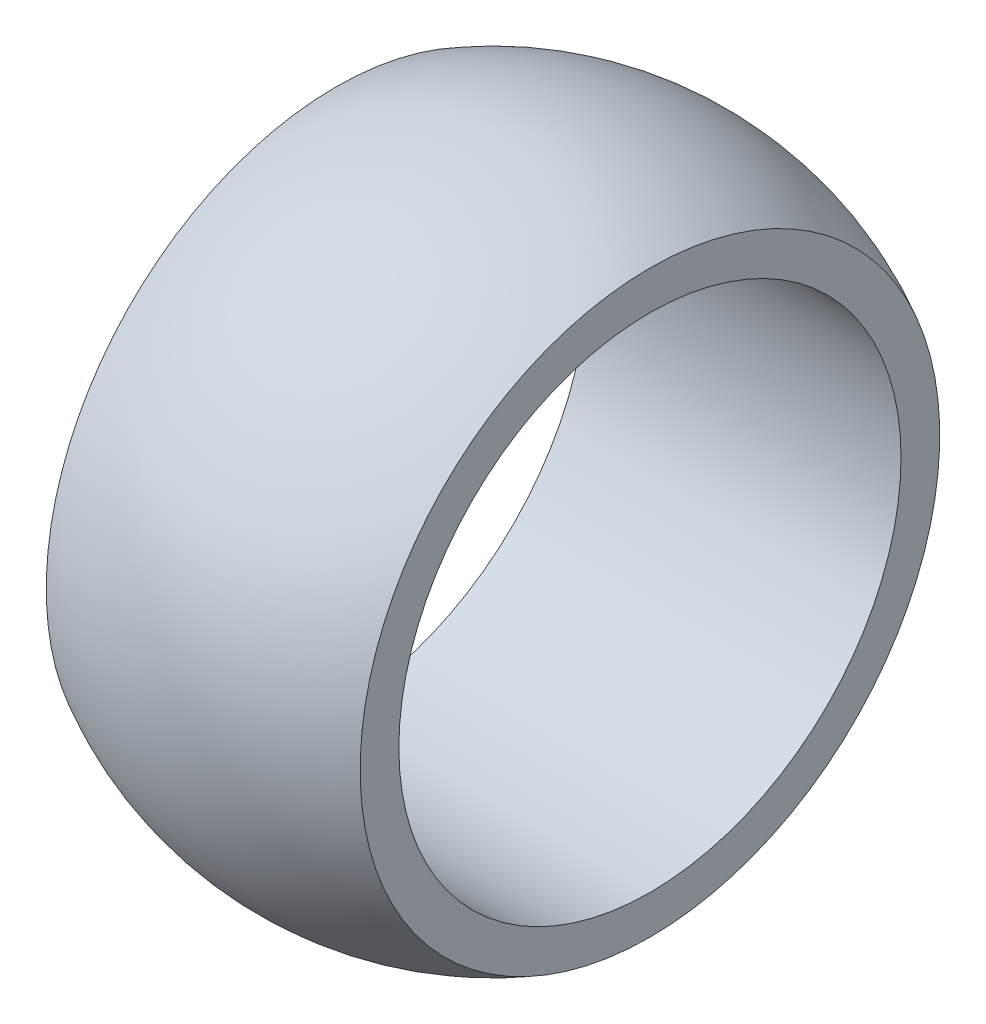
ISO-10303-21;
HEADER;
FILE_DESCRIPTION(('STEP AP214'),'2;1');
FILE_NAME('part.step','',(''),(''),'','','');
FILE_SCHEMA(('AUTOMOTIVE_DESIGN { 1 0 10303 214 1 1 1 1 }'));
ENDSEC;
DATA;
#1=APPLICATION_CONTEXT('core data for automotive mechanical design processes');
#2=APPLICATION_PROTOCOL_DEFINITION('international standard','automotive_design',2000,#1);
#3=PRODUCT_CONTEXT('',#1,'mechanical');
#4=PRODUCT('Part','Part','',(#3));
#5=PRODUCT_RELATED_PRODUCT_CATEGORY('part','',(#4));
#6=PRODUCT_DEFINITION_FORMATION('','',#4);
#7=PRODUCT_DEFINITION_CONTEXT('part definition',#1,'design');
#8=PRODUCT_DEFINITION('design','',#6,#7);
#9=PRODUCT_DEFINITION_SHAPE('','',#8);
#10=(LENGTH_UNIT() NAMED_UNIT(*) SI_UNIT(.MILLI.,.METRE.));
#11=(NAMED_UNIT(*) PLANE_ANGLE_UNIT() SI_UNIT($,.RADIAN.));
#12=(NAMED_UNIT(*) SI_UNIT($,.STERADIAN.) SOLID_ANGLE_UNIT());
#13=UNCERTAINTY_MEASURE_WITH_UNIT(LENGTH_MEASURE(1.E-05),#10,'distance_accuracy_value','');
#14=(GEOMETRIC_REPRESENTATION_CONTEXT(3) GLOBAL_UNCERTAINTY_ASSIGNED_CONTEXT((#13)) GLOBAL_UNIT_ASSIGNED_CONTEXT((#10,
#11,#12)) REPRESENTATION_CONTEXT('',''));
#15=CARTESIAN_POINT('',(0.,0.,0.));
#16=DIRECTION('',(0.,0.,1.));
#17=DIRECTION('',(1.,0.,0.));
#18=AXIS2_PLACEMENT_3D('',#15,#16,#17);
#19=CARTESIAN_POINT('',(0.,0.,0.));
#20=DIRECTION('',(-1.,0.,0.));
#21=DIRECTION('',(0.,1.,0.));
#22=AXIS2_PLACEMENT_3D('',#19,#20,#21);
#23=SPHERICAL_SURFACE('',#22,5.25);
#24=CARTESIAN_POINT('',(-2.5,0.,0.));
#25=DIRECTION('',(-1.,0.,0.));
#26=DIRECTION('',(0.,0.,1.));
#27=AXIS2_PLACEMENT_3D('',#24,#25,#26);
#28=CIRCLE('',#27,4.61654632815485);
#29=CARTESIAN_POINT('',(-2.5,4.61654632815485,0.));
#30=VERTEX_POINT('',#29);
#31=EDGE_CURVE('E10',#30,#30,#28,.T.);
#32=CARTESIAN_POINT('',(2.5,0.,0.));
#33=DIRECTION('',(-1.,0.,0.));
#34=DIRECTION('',(0.,0.,1.));
#35=AXIS2_PLACEMENT_3D('',#32,#33,#34);
#36=CIRCLE('',#35,4.61654632815485);
#37=CARTESIAN_POINT('',(2.5,4.61654632815485,0.));
#38=VERTEX_POINT('',#37);
#39=EDGE_CURVE('E45',#38,#38,#36,.T.);
#40=CARTESIAN_POINT('',(-2.5,4.61654632815485,0.));
#41=CARTESIAN_POINT('',(-2.45226529545904,4.64239645064112,0.));
#42=CARTESIAN_POINT('',(-2.40412940342641,4.66750570004983,0.));
#43=CARTESIAN_POINT('',(-2.30710213175535,4.71621943562572,0.));
#44=CARTESIAN_POINT('',(-2.25821075211691,4.73982392179291,0.));
#45=CARTESIAN_POINT('',(-2.15971939261171,4.78550511379942,0.));
#46=CARTESIAN_POINT('',(-2.11011941274496,4.80758181963874,0.));
#47=CARTESIAN_POINT('',(-2.01025861671332,4.85018629180179,0.));
#48=CARTESIAN_POINT('',(-1.95999780054843,4.87071405812553,0.));
#49=CARTESIAN_POINT('',(-1.85886367948767,4.91020087843826,0.));
#50=CARTESIAN_POINT('',(-1.8079903745918,4.92915993242725,0.));
#51=CARTESIAN_POINT('',(-1.705680226928,4.96549109244551,0.));
#52=CARTESIAN_POINT('',(-1.65424338416006,4.98286319847477,0.));
#53=CARTESIAN_POINT('',(-1.55085565007377,5.0160037463722,0.));
#54=CARTESIAN_POINT('',(-1.4989047587554,5.03177218824035,0.));
#55=CARTESIAN_POINT('',(-1.39453891248721,5.06169023658425,0.));
#56=CARTESIAN_POINT('',(-1.34212395753739,5.07583984305998,0.));
#57=CARTESIAN_POINT('',(-1.23688041515648,5.10250660641923,0.));
#58=CARTESIAN_POINT('',(-1.18405182772539,5.11502376330274,0.));
#59=CARTESIAN_POINT('',(-1.07803184958195,5.13841358408763,0.));
#60=CARTESIAN_POINT('',(-1.0248404588696,5.14928624798901,0.));
#61=CARTESIAN_POINT('',(-0.918146052416608,5.16937662163513,0.));
#62=CARTESIAN_POINT('',(-0.864643036675963,5.17859433137987,0.));
#63=CARTESIAN_POINT('',(-0.757376858255481,5.19536592786764,0.));
#64=CARTESIAN_POINT('',(-0.703613695575643,5.20291981461068,0.));
#65=CARTESIAN_POINT('',(-0.595878951665652,5.21635649709955,0.));
#66=CARTESIAN_POINT('',(-0.541907370435499,5.22223929284538,0.));
#67=CARTESIAN_POINT('',(-0.433807718344663,5.23232813319032,0.));
#68=CARTESIAN_POINT('',(-0.37967964748398,5.23653417778943,0.));
#69=CARTESIAN_POINT('',(-0.271319095618742,5.24326546898239,0.));
#70=CARTESIAN_POINT('',(-0.217086614614186,5.24579071557623,0.));
#71=CARTESIAN_POINT('',(-0.10856942240642,5.24915798108504,0.));
#72=CARTESIAN_POINT('',(-0.0542847112032102,5.25,0.));
#73=CARTESIAN_POINT('',(0.0542847112032102,5.25,0.));
#74=CARTESIAN_POINT('',(0.10856942240642,5.24915798108504,0.));
#75=CARTESIAN_POINT('',(0.217086614614186,5.24579071557623,0.));
#76=CARTESIAN_POINT('',(0.271319095618742,5.24326546898239,0.));
#77=CARTESIAN_POINT('',(0.37967964748398,5.23653417778943,0.));
#78=CARTESIAN_POINT('',(0.433807718344663,5.23232813319032,0.));
#79=CARTESIAN_POINT('',(0.541907370435499,5.22223929284538,0.));
#80=CARTESIAN_POINT('',(0.595878951665652,5.21635649709955,0.));
#81=CARTESIAN_POINT('',(0.703613695575643,5.20291981461068,0.));
#82=CARTESIAN_POINT('',(0.757376858255481,5.19536592786764,0.));
#83=CARTESIAN_POINT('',(0.864643036675963,5.17859433137987,0.));
#84=CARTESIAN_POINT('',(0.918146052416608,5.16937662163513,0.));
#85=CARTESIAN_POINT('',(1.0248404588696,5.14928624798901,0.));
#86=CARTESIAN_POINT('',(1.07803184958195,5.13841358408763,0.));
#87=CARTESIAN_POINT('',(1.18405182772539,5.11502376330274,0.));
#88=CARTESIAN_POINT('',(1.23688041515648,5.10250660641923,0.));
#89=CARTESIAN_POINT('',(1.34212395753739,5.07583984305998,0.));
#90=CARTESIAN_POINT('',(1.39453891248721,5.06169023658425,0.));
#91=CARTESIAN_POINT('',(1.4989047587554,5.03177218824035,0.));
#92=CARTESIAN_POINT('',(1.55085565007377,5.0160037463722,0.));
#93=CARTESIAN_POINT('',(1.65424338416006,4.98286319847477,0.));
#94=CARTESIAN_POINT('',(1.705680226928,4.96549109244551,0.));
#95=CARTESIAN_POINT('',(1.8079903745918,4.92915993242725,0.));
#96=CARTESIAN_POINT('',(1.85886367948767,4.91020087843826,0.));
#97=CARTESIAN_POINT('',(1.95999780054843,4.87071405812553,0.));
#98=CARTESIAN_POINT('',(2.01025861671332,4.85018629180179,0.));
#99=CARTESIAN_POINT('',(2.11011941274496,4.80758181963874,0.));
#100=CARTESIAN_POINT('',(2.15971939261171,4.78550511379942,0.));
#101=CARTESIAN_POINT('',(2.25821075211691,4.73982392179291,0.));
#102=CARTESIAN_POINT('',(2.30710213175535,4.71621943562572,0.));
#103=CARTESIAN_POINT('',(2.40412940342641,4.66750570004983,0.));
#104=CARTESIAN_POINT('',(2.45226529545904,4.64239645064112,0.));
#105=CARTESIAN_POINT('',(2.5,4.61654632815485,0.));
#106=B_SPLINE_CURVE_WITH_KNOTS('',3,(#40,#41,#42,#43,#44,#45,#46,#47,#48,#49,#50,#51,#52,#53,
#54,#55,#56,#57,#58,#59,#60,#61,#62,#63,#64,#65,#66,#67,#68,#69,#70,#71,#72,#73,#74,#75,#76,#77,
#78,#79,#80,#81,#82,#83,#84,#85,#86,#87,#88,#89,#90,#91,#92,#93,#94,#95,#96,#97,#98,#99,#100,
#101,#102,#103,#104,#105),.UNSPECIFIED.,.F.,.F.,(4,2,2,2,2,2,2,2,2,2,2,2,2,2,2,2,2,2,2,2,2,2,2,
2,2,2,2,2,2,2,2,2,4),(0.,0.162847605227546,0.325695210455092,0.488542815682638,
0.651390420910184,0.81423802613773,0.977085631365276,1.13993323659282,1.30278084182037,
1.46562844704791,1.62847605227546,1.79132365750301,1.95417126273055,2.1170188679581,
2.27986647318564,2.44271407841319,2.60556168364073,2.76840928886828,2.93125689409583,
3.09410449932337,3.25695210455092,3.41979970977846,3.58264731500601,3.74549492023356,
3.9083425254611,4.07119013068865,4.2340377359162,4.39688534114374,4.55973294637129,
4.72258055159883,4.88542815682638,5.04827576205393,5.21112336728147),.UNSPECIFIED.);
#107=EDGE_CURVE('BSEAM31',#30,#38,#106,.T.);
#108=ORIENTED_EDGE('',*,*,#31,.F.);
#109=ORIENTED_EDGE('',*,*,#39,.T.);
#110=ORIENTED_EDGE('',*,*,#107,.T.);
#111=ORIENTED_EDGE('',*,*,#107,.F.);
#112=EDGE_LOOP('',(#108,#110,#109,#111));
#113=FACE_BOUND('',#112,.T.);
#114=ADVANCED_FACE('F31',(#113),#23,.T.);
#115=CARTESIAN_POINT('',(-2.5,4.61654632815485,0.));
#116=DIRECTION('',(1.,0.,0.));
#117=DIRECTION('',(0.,0.,-1.));
#118=AXIS2_PLACEMENT_3D('',#115,#116,#117);
#119=PLANE('',#118);
#120=CARTESIAN_POINT('',(-2.5,0.,0.));
#121=DIRECTION('',(-1.,0.,0.));
#122=DIRECTION('',(0.,0.,1.));
#123=AXIS2_PLACEMENT_3D('',#120,#121,#122);
#124=CIRCLE('',#123,3.99999999999998);
#125=CARTESIAN_POINT('',(-2.5,0.,3.99999999999998));
#126=VERTEX_POINT('',#125);
#127=EDGE_CURVE('E37',#126,#126,#124,.T.);
#128=ORIENTED_EDGE('',*,*,#127,.F.);
#129=EDGE_LOOP('',(#128));
#130=FACE_BOUND('',#129,.T.);
#131=ORIENTED_EDGE('',*,*,#31,.T.);
#132=EDGE_LOOP('',(#131));
#133=FACE_BOUND('',#132,.T.);
#134=ADVANCED_FACE('F60',(#130,#133),#119,.F.);
#135=CARTESIAN_POINT('',(-124.153021442495,0.,0.));
#136=DIRECTION('',(-1.,0.,0.));
#137=DIRECTION('',(0.,0.,1.));
#138=AXIS2_PLACEMENT_3D('',#135,#136,#137);
#139=CYLINDRICAL_SURFACE('',#138,3.99999999999998);
#140=CARTESIAN_POINT('',(2.5,0.,0.));
#141=DIRECTION('',(-1.,0.,0.));
#142=DIRECTION('',(0.,0.,1.));
#143=AXIS2_PLACEMENT_3D('',#140,#141,#142);
#144=CIRCLE('',#143,3.99999999999998);
#145=CARTESIAN_POINT('',(2.5,0.,3.99999999999998));
#146=VERTEX_POINT('',#145);
#147=EDGE_CURVE('E41',#146,#146,#144,.T.);
#148=ORIENTED_EDGE('',*,*,#147,.F.);
#149=EDGE_LOOP('',(#148));
#150=FACE_BOUND('',#149,.T.);
#151=ORIENTED_EDGE('',*,*,#127,.T.);
#152=EDGE_LOOP('',(#151));
#153=FACE_BOUND('',#152,.T.);
#154=ADVANCED_FACE('F55',(#150,#153),#139,.F.);
#155=CARTESIAN_POINT('',(2.5,4.61654632815485,0.));
#156=DIRECTION('',(-1.,0.,0.));
#157=DIRECTION('',(0.,0.,1.));
#158=AXIS2_PLACEMENT_3D('',#155,#156,#157);
#159=PLANE('',#158);
#160=ORIENTED_EDGE('',*,*,#39,.F.);
#161=EDGE_LOOP('',(#160));
#162=FACE_BOUND('',#161,.T.);
#163=ORIENTED_EDGE('',*,*,#147,.T.);
#164=EDGE_LOOP('',(#163));
#165=FACE_BOUND('',#164,.T.);
#166=ADVANCED_FACE('F52',(#162,#165),#159,.F.);
#167=CLOSED_SHELL('',(#114,#134,#154,#166));
#168=MANIFOLD_SOLID_BREP('B2',#167);
#169=ADVANCED_BREP_SHAPE_REPRESENTATION('',(#18,#168),#14);
#170=SHAPE_DEFINITION_REPRESENTATION(#9,#169);
ENDSEC;
END-ISO-10303-21;
